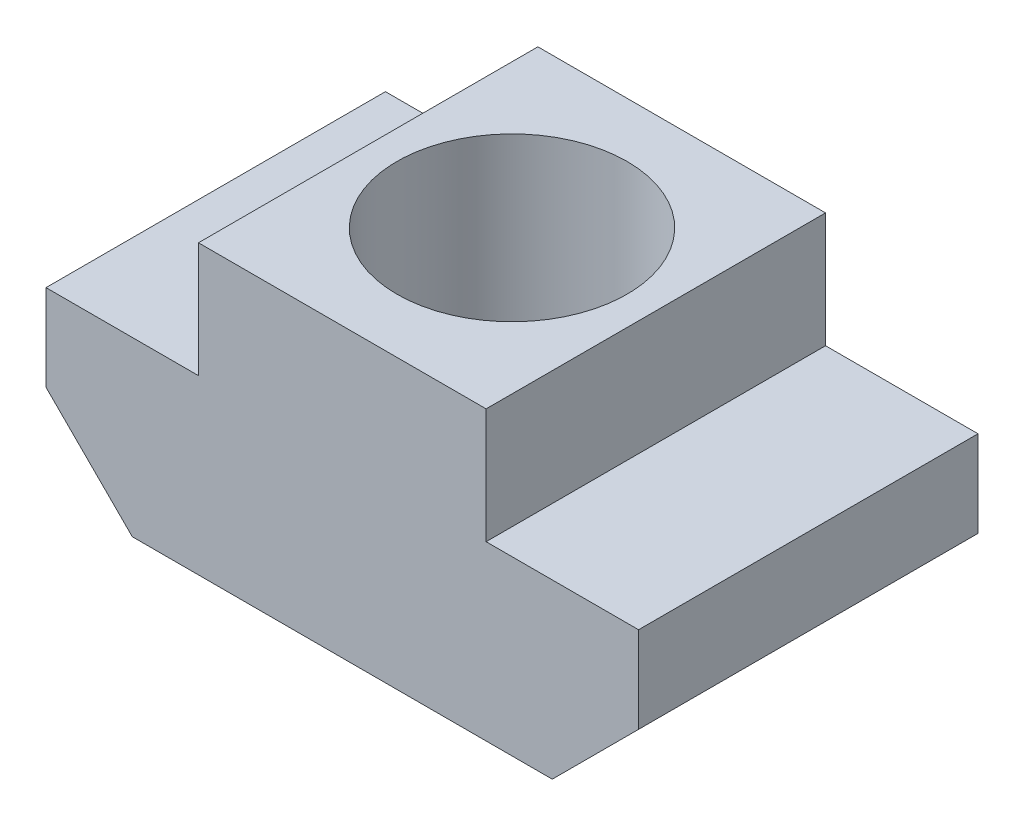
ISO-10303-21;
HEADER;
FILE_DESCRIPTION(('STEP AP214'),'2;1');
FILE_NAME('part.step','',(''),(''),'','','');
FILE_SCHEMA(('AUTOMOTIVE_DESIGN { 1 0 10303 214 1 1 1 1 }'));
ENDSEC;
DATA;
#1=APPLICATION_CONTEXT('core data for automotive mechanical design processes');
#2=APPLICATION_PROTOCOL_DEFINITION('international standard','automotive_design',2000,#1);
#3=PRODUCT_CONTEXT('',#1,'mechanical');
#4=PRODUCT('Part','Part','',(#3));
#5=PRODUCT_RELATED_PRODUCT_CATEGORY('part','',(#4));
#6=PRODUCT_DEFINITION_FORMATION('','',#4);
#7=PRODUCT_DEFINITION_CONTEXT('part definition',#1,'design');
#8=PRODUCT_DEFINITION('design','',#6,#7);
#9=PRODUCT_DEFINITION_SHAPE('','',#8);
#10=(LENGTH_UNIT() NAMED_UNIT(*) SI_UNIT(.MILLI.,.METRE.));
#11=(NAMED_UNIT(*) PLANE_ANGLE_UNIT() SI_UNIT($,.RADIAN.));
#12=(NAMED_UNIT(*) SI_UNIT($,.STERADIAN.) SOLID_ANGLE_UNIT());
#13=UNCERTAINTY_MEASURE_WITH_UNIT(LENGTH_MEASURE(1.E-05),#10,'distance_accuracy_value','');
#14=(GEOMETRIC_REPRESENTATION_CONTEXT(3) GLOBAL_UNCERTAINTY_ASSIGNED_CONTEXT((#13)) GLOBAL_UNIT_ASSIGNED_CONTEXT((#10,
#11,#12)) REPRESENTATION_CONTEXT('',''));
#15=CARTESIAN_POINT('',(0.,0.,0.));
#16=DIRECTION('',(0.,0.,1.));
#17=DIRECTION('',(1.,0.,0.));
#18=AXIS2_PLACEMENT_3D('',#15,#16,#17);
#19=CARTESIAN_POINT('',(0.,3.,-2.95));
#20=DIRECTION('',(0.,0.,1.));
#21=DIRECTION('',(1.,0.,0.));
#22=AXIS2_PLACEMENT_3D('',#19,#20,#21);
#23=PLANE('',#22);
#24=DIRECTION('',(-1.,0.,0.));
#25=VECTOR('',#24,1.);
#26=CARTESIAN_POINT('',(0.,0.,-2.95));
#27=LINE('',#26,#25);
#28=CARTESIAN_POINT('',(3.65000000000004,0.,-2.95));
#29=VERTEX_POINT('',#28);
#30=CARTESIAN_POINT('',(-3.64999999999996,0.,-2.95));
#31=VERTEX_POINT('',#30);
#32=EDGE_CURVE('E132',#29,#31,#27,.T.);
#33=ORIENTED_EDGE('',*,*,#32,.T.);
#34=DIRECTION('',(-0.707106781186557,0.707106781186538,0.));
#35=VECTOR('',#34,1.);
#36=CARTESIAN_POINT('',(-5.15,1.5,-2.95));
#37=LINE('',#36,#35);
#38=CARTESIAN_POINT('',(-5.15,1.5,-2.95));
#39=VERTEX_POINT('',#38);
#40=EDGE_CURVE('E56',#31,#39,#37,.T.);
#41=ORIENTED_EDGE('',*,*,#40,.T.);
#42=DIRECTION('',(0.,-1.,0.));
#43=VECTOR('',#42,1.);
#44=CARTESIAN_POINT('',(-5.15,3.,-2.95));
#45=LINE('',#44,#43);
#46=CARTESIAN_POINT('',(-5.15,3.,-2.95));
#47=VERTEX_POINT('',#46);
#48=EDGE_CURVE('E11',#47,#39,#45,.T.);
#49=ORIENTED_EDGE('',*,*,#48,.F.);
#50=DIRECTION('',(-1.,0.,0.));
#51=VECTOR('',#50,1.);
#52=CARTESIAN_POINT('',(0.,3.,-2.95));
#53=LINE('',#52,#51);
#54=CARTESIAN_POINT('',(-2.5,3.,-2.95));
#55=VERTEX_POINT('',#54);
#56=EDGE_CURVE('E141',#55,#47,#53,.T.);
#57=ORIENTED_EDGE('',*,*,#56,.F.);
#58=DIRECTION('',(0.,-1.,0.));
#59=VECTOR('',#58,1.);
#60=CARTESIAN_POINT('',(-2.5,5.,-2.95));
#61=LINE('',#60,#59);
#62=CARTESIAN_POINT('',(-2.5,5.,-2.95));
#63=VERTEX_POINT('',#62);
#64=EDGE_CURVE('E153',#63,#55,#61,.T.);
#65=ORIENTED_EDGE('',*,*,#64,.F.);
#66=DIRECTION('',(-1.,0.,0.));
#67=VECTOR('',#66,1.);
#68=CARTESIAN_POINT('',(0.,5.,-2.95));
#69=LINE('',#68,#67);
#70=CARTESIAN_POINT('',(2.5,5.,-2.95));
#71=VERTEX_POINT('',#70);
#72=EDGE_CURVE('E200',#71,#63,#69,.T.);
#73=ORIENTED_EDGE('',*,*,#72,.F.);
#74=DIRECTION('',(0.,-1.,0.));
#75=VECTOR('',#74,1.);
#76=CARTESIAN_POINT('',(2.5,5.,-2.95));
#77=LINE('',#76,#75);
#78=CARTESIAN_POINT('',(2.5,3.,-2.95));
#79=VERTEX_POINT('',#78);
#80=EDGE_CURVE('E180',#71,#79,#77,.T.);
#81=ORIENTED_EDGE('',*,*,#80,.T.);
#82=DIRECTION('',(-1.,0.,0.));
#83=VECTOR('',#82,1.);
#84=CARTESIAN_POINT('',(0.,3.,-2.95));
#85=LINE('',#84,#83);
#86=CARTESIAN_POINT('',(5.15,3.,-2.95));
#87=VERTEX_POINT('',#86);
#88=EDGE_CURVE('E124',#87,#79,#85,.T.);
#89=ORIENTED_EDGE('',*,*,#88,.F.);
#90=DIRECTION('',(0.,-1.,0.));
#91=VECTOR('',#90,1.);
#92=CARTESIAN_POINT('',(5.15,3.,-2.95));
#93=LINE('',#92,#91);
#94=CARTESIAN_POINT('',(5.15,1.5,-2.95));
#95=VERTEX_POINT('',#94);
#96=EDGE_CURVE('E210',#87,#95,#93,.T.);
#97=ORIENTED_EDGE('',*,*,#96,.T.);
#98=DIRECTION('',(-0.707106781186538,-0.707106781186557,0.));
#99=VECTOR('',#98,1.);
#100=CARTESIAN_POINT('',(5.15,1.5,-2.95));
#101=LINE('',#100,#99);
#102=EDGE_CURVE('E64',#95,#29,#101,.T.);
#103=ORIENTED_EDGE('',*,*,#102,.T.);
#104=EDGE_LOOP('',(#33,#41,#49,#57,#65,#73,#81,#89,#97,#103));
#105=FACE_BOUND('',#104,.T.);
#106=ADVANCED_FACE('F41',(#105),#23,.F.);
#107=CARTESIAN_POINT('',(-5.15,3.,0.));
#108=DIRECTION('',(1.,0.,0.));
#109=DIRECTION('',(0.,0.,-1.));
#110=AXIS2_PLACEMENT_3D('',#107,#108,#109);
#111=PLANE('',#110);
#112=ORIENTED_EDGE('',*,*,#48,.T.);
#113=DIRECTION('',(0.,0.,1.));
#114=VECTOR('',#113,1.);
#115=CARTESIAN_POINT('',(-5.15,1.5,-2.95));
#116=LINE('',#115,#114);
#117=CARTESIAN_POINT('',(-5.15,1.5,2.95));
#118=VERTEX_POINT('',#117);
#119=EDGE_CURVE('E116',#39,#118,#116,.T.);
#120=ORIENTED_EDGE('',*,*,#119,.T.);
#121=DIRECTION('',(0.,-1.,0.));
#122=VECTOR('',#121,1.);
#123=CARTESIAN_POINT('',(-5.15,3.,2.95));
#124=LINE('',#123,#122);
#125=CARTESIAN_POINT('',(-5.15,3.,2.95));
#126=VERTEX_POINT('',#125);
#127=EDGE_CURVE('E49',#126,#118,#124,.T.);
#128=ORIENTED_EDGE('',*,*,#127,.F.);
#129=DIRECTION('',(0.,0.,1.));
#130=VECTOR('',#129,1.);
#131=CARTESIAN_POINT('',(-5.15,3.,0.));
#132=LINE('',#131,#130);
#133=EDGE_CURVE('E136',#47,#126,#132,.T.);
#134=ORIENTED_EDGE('',*,*,#133,.F.);
#135=EDGE_LOOP('',(#112,#120,#128,#134));
#136=FACE_BOUND('',#135,.T.);
#137=ADVANCED_FACE('F135',(#136),#111,.F.);
#138=CARTESIAN_POINT('',(0.,3.,2.95));
#139=DIRECTION('',(0.,0.,1.));
#140=DIRECTION('',(1.,0.,0.));
#141=AXIS2_PLACEMENT_3D('',#138,#139,#140);
#142=PLANE('',#141);
#143=DIRECTION('',(-0.707106781186557,0.707106781186538,0.));
#144=VECTOR('',#143,1.);
#145=CARTESIAN_POINT('',(-5.15,1.5,2.95));
#146=LINE('',#145,#144);
#147=CARTESIAN_POINT('',(-3.64999999999996,0.,2.95));
#148=VERTEX_POINT('',#147);
#149=EDGE_CURVE('E119',#148,#118,#146,.T.);
#150=ORIENTED_EDGE('',*,*,#149,.F.);
#151=DIRECTION('',(-1.,0.,0.));
#152=VECTOR('',#151,1.);
#153=CARTESIAN_POINT('',(0.,0.,2.95));
#154=LINE('',#153,#152);
#155=CARTESIAN_POINT('',(3.65000000000004,0.,2.95));
#156=VERTEX_POINT('',#155);
#157=EDGE_CURVE('E152',#156,#148,#154,.T.);
#158=ORIENTED_EDGE('',*,*,#157,.F.);
#159=DIRECTION('',(-0.707106781186538,-0.707106781186557,0.));
#160=VECTOR('',#159,1.);
#161=CARTESIAN_POINT('',(5.15,1.5,2.95));
#162=LINE('',#161,#160);
#163=CARTESIAN_POINT('',(5.15,1.5,2.95));
#164=VERTEX_POINT('',#163);
#165=EDGE_CURVE('E236',#164,#156,#162,.T.);
#166=ORIENTED_EDGE('',*,*,#165,.F.);
#167=DIRECTION('',(0.,-1.,0.));
#168=VECTOR('',#167,1.);
#169=CARTESIAN_POINT('',(5.15,3.,2.95));
#170=LINE('',#169,#168);
#171=CARTESIAN_POINT('',(5.15,3.,2.95));
#172=VERTEX_POINT('',#171);
#173=EDGE_CURVE('E190',#172,#164,#170,.T.);
#174=ORIENTED_EDGE('',*,*,#173,.F.);
#175=DIRECTION('',(-1.,0.,0.));
#176=VECTOR('',#175,1.);
#177=CARTESIAN_POINT('',(0.,3.,2.95));
#178=LINE('',#177,#176);
#179=CARTESIAN_POINT('',(2.5,3.,2.95));
#180=VERTEX_POINT('',#179);
#181=EDGE_CURVE('E218',#172,#180,#178,.T.);
#182=ORIENTED_EDGE('',*,*,#181,.T.);
#183=DIRECTION('',(0.,-1.,0.));
#184=VECTOR('',#183,1.);
#185=CARTESIAN_POINT('',(2.5,5.,2.95));
#186=LINE('',#185,#184);
#187=CARTESIAN_POINT('',(2.5,5.,2.95));
#188=VERTEX_POINT('',#187);
#189=EDGE_CURVE('E177',#188,#180,#186,.T.);
#190=ORIENTED_EDGE('',*,*,#189,.F.);
#191=DIRECTION('',(-1.,0.,0.));
#192=VECTOR('',#191,1.);
#193=CARTESIAN_POINT('',(0.,5.,2.95));
#194=LINE('',#193,#192);
#195=CARTESIAN_POINT('',(-2.5,5.,2.95));
#196=VERTEX_POINT('',#195);
#197=EDGE_CURVE('E194',#188,#196,#194,.T.);
#198=ORIENTED_EDGE('',*,*,#197,.T.);
#199=DIRECTION('',(0.,-1.,0.));
#200=VECTOR('',#199,1.);
#201=CARTESIAN_POINT('',(-2.5,5.,2.95));
#202=LINE('',#201,#200);
#203=CARTESIAN_POINT('',(-2.5,3.,2.95));
#204=VERTEX_POINT('',#203);
#205=EDGE_CURVE('E163',#196,#204,#202,.T.);
#206=ORIENTED_EDGE('',*,*,#205,.T.);
#207=DIRECTION('',(-1.,0.,0.));
#208=VECTOR('',#207,1.);
#209=CARTESIAN_POINT('',(0.,3.,2.95));
#210=LINE('',#209,#208);
#211=EDGE_CURVE('E140',#204,#126,#210,.T.);
#212=ORIENTED_EDGE('',*,*,#211,.T.);
#213=ORIENTED_EDGE('',*,*,#127,.T.);
#214=EDGE_LOOP('',(#150,#158,#166,#174,#182,#190,#198,#206,#212,#213));
#215=FACE_BOUND('',#214,.T.);
#216=ADVANCED_FACE('F158',(#215),#142,.T.);
#217=CARTESIAN_POINT('',(0.,3.,0.));
#218=DIRECTION('',(0.,1.,0.));
#219=DIRECTION('',(0.,0.,1.));
#220=AXIS2_PLACEMENT_3D('',#217,#218,#219);
#221=PLANE('',#220);
#222=DIRECTION('',(0.,0.,1.));
#223=VECTOR('',#222,1.);
#224=CARTESIAN_POINT('',(-2.5,3.,0.));
#225=LINE('',#224,#223);
#226=EDGE_CURVE('E146',#55,#204,#225,.T.);
#227=ORIENTED_EDGE('',*,*,#226,.F.);
#228=ORIENTED_EDGE('',*,*,#56,.T.);
#229=ORIENTED_EDGE('',*,*,#133,.T.);
#230=ORIENTED_EDGE('',*,*,#211,.F.);
#231=EDGE_LOOP('',(#227,#228,#229,#230));
#232=FACE_BOUND('',#231,.T.);
#233=ADVANCED_FACE('F166',(#232),#221,.T.);
#234=CARTESIAN_POINT('',(0.,0.,0.));
#235=DIRECTION('',(0.,1.,0.));
#236=DIRECTION('',(0.,0.,1.));
#237=AXIS2_PLACEMENT_3D('',#234,#235,#236);
#238=PLANE('',#237);
#239=ORIENTED_EDGE('',*,*,#157,.T.);
#240=DIRECTION('',(0.,0.,1.));
#241=VECTOR('',#240,1.);
#242=CARTESIAN_POINT('',(-3.64999999999996,0.,-2.95));
#243=LINE('',#242,#241);
#244=EDGE_CURVE('E125',#31,#148,#243,.T.);
#245=ORIENTED_EDGE('',*,*,#244,.F.);
#246=ORIENTED_EDGE('',*,*,#32,.F.);
#247=DIRECTION('',(0.,0.,1.));
#248=VECTOR('',#247,1.);
#249=CARTESIAN_POINT('',(3.65000000000004,0.,-2.95));
#250=LINE('',#249,#248);
#251=EDGE_CURVE('E232',#29,#156,#250,.T.);
#252=ORIENTED_EDGE('',*,*,#251,.T.);
#253=EDGE_LOOP('',(#239,#245,#246,#252));
#254=FACE_BOUND('',#253,.T.);
#255=CARTESIAN_POINT('',(0.,0.,0.));
#256=DIRECTION('',(0.,1.,0.));
#257=DIRECTION('',(0.,0.,1.));
#258=AXIS2_PLACEMENT_3D('',#255,#256,#257);
#259=CIRCLE('',#258,2.);
#260=CARTESIAN_POINT('',(0.,0.,2.));
#261=VERTEX_POINT('',#260);
#262=EDGE_CURVE('E185',#261,#261,#259,.T.);
#263=ORIENTED_EDGE('',*,*,#262,.T.);
#264=EDGE_LOOP('',(#263));
#265=FACE_BOUND('',#264,.T.);
#266=ADVANCED_FACE('F245',(#254,#265),#238,.F.);
#267=CARTESIAN_POINT('',(-2.5,5.,0.));
#268=DIRECTION('',(1.,0.,0.));
#269=DIRECTION('',(0.,0.,-1.));
#270=AXIS2_PLACEMENT_3D('',#267,#268,#269);
#271=PLANE('',#270);
#272=ORIENTED_EDGE('',*,*,#64,.T.);
#273=ORIENTED_EDGE('',*,*,#226,.T.);
#274=ORIENTED_EDGE('',*,*,#205,.F.);
#275=DIRECTION('',(0.,0.,1.));
#276=VECTOR('',#275,1.);
#277=CARTESIAN_POINT('',(-2.5,5.,0.));
#278=LINE('',#277,#276);
#279=EDGE_CURVE('E197',#63,#196,#278,.T.);
#280=ORIENTED_EDGE('',*,*,#279,.F.);
#281=EDGE_LOOP('',(#272,#273,#274,#280));
#282=FACE_BOUND('',#281,.T.);
#283=ADVANCED_FACE('F169',(#282),#271,.F.);
#284=CARTESIAN_POINT('',(0.,5.,0.));
#285=DIRECTION('',(0.,-1.,0.));
#286=DIRECTION('',(0.,0.,-1.));
#287=AXIS2_PLACEMENT_3D('',#284,#285,#286);
#288=CYLINDRICAL_SURFACE('',#287,2.);
#289=CARTESIAN_POINT('',(0.,5.,0.));
#290=DIRECTION('',(0.,1.,0.));
#291=DIRECTION('',(0.,0.,1.));
#292=AXIS2_PLACEMENT_3D('',#289,#290,#291);
#293=CIRCLE('',#292,2.);
#294=CARTESIAN_POINT('',(0.,5.,2.));
#295=VERTEX_POINT('',#294);
#296=EDGE_CURVE('E189',#295,#295,#293,.T.);
#297=ORIENTED_EDGE('',*,*,#296,.T.);
#298=EDGE_LOOP('',(#297));
#299=FACE_BOUND('',#298,.T.);
#300=ORIENTED_EDGE('',*,*,#262,.F.);
#301=EDGE_LOOP('',(#300));
#302=FACE_BOUND('',#301,.T.);
#303=ADVANCED_FACE('F263',(#299,#302),#288,.F.);
#304=CARTESIAN_POINT('',(2.5,5.,0.));
#305=DIRECTION('',(1.,0.,0.));
#306=DIRECTION('',(0.,0.,-1.));
#307=AXIS2_PLACEMENT_3D('',#304,#305,#306);
#308=PLANE('',#307);
#309=DIRECTION('',(0.,0.,1.));
#310=VECTOR('',#309,1.);
#311=CARTESIAN_POINT('',(2.5,3.,0.));
#312=LINE('',#311,#310);
#313=EDGE_CURVE('E222',#79,#180,#312,.T.);
#314=ORIENTED_EDGE('',*,*,#313,.F.);
#315=ORIENTED_EDGE('',*,*,#80,.F.);
#316=DIRECTION('',(0.,0.,1.));
#317=VECTOR('',#316,1.);
#318=CARTESIAN_POINT('',(2.5,5.,0.));
#319=LINE('',#318,#317);
#320=EDGE_CURVE('E184',#71,#188,#319,.T.);
#321=ORIENTED_EDGE('',*,*,#320,.T.);
#322=ORIENTED_EDGE('',*,*,#189,.T.);
#323=EDGE_LOOP('',(#314,#315,#321,#322));
#324=FACE_BOUND('',#323,.T.);
#325=ADVANCED_FACE('F260',(#324),#308,.T.);
#326=CARTESIAN_POINT('',(0.,5.,0.));
#327=DIRECTION('',(0.,1.,0.));
#328=DIRECTION('',(0.,0.,1.));
#329=AXIS2_PLACEMENT_3D('',#326,#327,#328);
#330=PLANE('',#329);
#331=ORIENTED_EDGE('',*,*,#296,.F.);
#332=EDGE_LOOP('',(#331));
#333=FACE_BOUND('',#332,.T.);
#334=ORIENTED_EDGE('',*,*,#72,.T.);
#335=ORIENTED_EDGE('',*,*,#279,.T.);
#336=ORIENTED_EDGE('',*,*,#197,.F.);
#337=ORIENTED_EDGE('',*,*,#320,.F.);
#338=EDGE_LOOP('',(#334,#335,#336,#337));
#339=FACE_BOUND('',#338,.T.);
#340=ADVANCED_FACE('F259',(#333,#339),#330,.T.);
#341=CARTESIAN_POINT('',(5.15,3.,0.));
#342=DIRECTION('',(1.,0.,0.));
#343=DIRECTION('',(0.,0.,-1.));
#344=AXIS2_PLACEMENT_3D('',#341,#342,#343);
#345=PLANE('',#344);
#346=DIRECTION('',(0.,0.,1.));
#347=VECTOR('',#346,1.);
#348=CARTESIAN_POINT('',(5.15,1.5,-2.95));
#349=LINE('',#348,#347);
#350=EDGE_CURVE('E229',#95,#164,#349,.T.);
#351=ORIENTED_EDGE('',*,*,#350,.F.);
#352=ORIENTED_EDGE('',*,*,#96,.F.);
#353=DIRECTION('',(0.,0.,1.));
#354=VECTOR('',#353,1.);
#355=CARTESIAN_POINT('',(5.15,3.,0.));
#356=LINE('',#355,#354);
#357=EDGE_CURVE('E214',#87,#172,#356,.T.);
#358=ORIENTED_EDGE('',*,*,#357,.T.);
#359=ORIENTED_EDGE('',*,*,#173,.T.);
#360=EDGE_LOOP('',(#351,#352,#358,#359));
#361=FACE_BOUND('',#360,.T.);
#362=ADVANCED_FACE('F250',(#361),#345,.T.);
#363=CARTESIAN_POINT('',(0.,3.,0.));
#364=DIRECTION('',(0.,1.,0.));
#365=DIRECTION('',(0.,0.,1.));
#366=AXIS2_PLACEMENT_3D('',#363,#364,#365);
#367=PLANE('',#366);
#368=ORIENTED_EDGE('',*,*,#88,.T.);
#369=ORIENTED_EDGE('',*,*,#313,.T.);
#370=ORIENTED_EDGE('',*,*,#181,.F.);
#371=ORIENTED_EDGE('',*,*,#357,.F.);
#372=EDGE_LOOP('',(#368,#369,#370,#371));
#373=FACE_BOUND('',#372,.T.);
#374=ADVANCED_FACE('F254',(#373),#367,.T.);
#375=CARTESIAN_POINT('',(5.15,1.5,-2.95));
#376=DIRECTION('',(-0.707106781186558,0.707106781186538,0.));
#377=DIRECTION('',(-0.707106781186538,-0.707106781186558,0.));
#378=AXIS2_PLACEMENT_3D('',#375,#376,#377);
#379=PLANE('',#378);
#380=ORIENTED_EDGE('',*,*,#165,.T.);
#381=ORIENTED_EDGE('',*,*,#251,.F.);
#382=ORIENTED_EDGE('',*,*,#102,.F.);
#383=ORIENTED_EDGE('',*,*,#350,.T.);
#384=EDGE_LOOP('',(#380,#381,#382,#383));
#385=FACE_BOUND('',#384,.T.);
#386=ADVANCED_FACE('F316',(#385),#379,.F.);
#387=CARTESIAN_POINT('',(-5.15,1.5,-2.95));
#388=DIRECTION('',(0.707106781186538,0.707106781186557,0.));
#389=DIRECTION('',(-0.707106781186557,0.707106781186538,0.));
#390=AXIS2_PLACEMENT_3D('',#387,#388,#389);
#391=PLANE('',#390);
#392=ORIENTED_EDGE('',*,*,#149,.T.);
#393=ORIENTED_EDGE('',*,*,#119,.F.);
#394=ORIENTED_EDGE('',*,*,#40,.F.);
#395=ORIENTED_EDGE('',*,*,#244,.T.);
#396=EDGE_LOOP('',(#392,#393,#394,#395));
#397=FACE_BOUND('',#396,.T.);
#398=ADVANCED_FACE('F117',(#397),#391,.F.);
#399=CLOSED_SHELL('',(#106,#137,#216,#233,#266,#283,#303,#325,#340,#362,#374,#386,#398));
#400=MANIFOLD_SOLID_BREP('B2',#399);
#401=ADVANCED_BREP_SHAPE_REPRESENTATION('',(#18,#400),#14);
#402=SHAPE_DEFINITION_REPRESENTATION(#9,#401);
ENDSEC;
END-ISO-10303-21;
